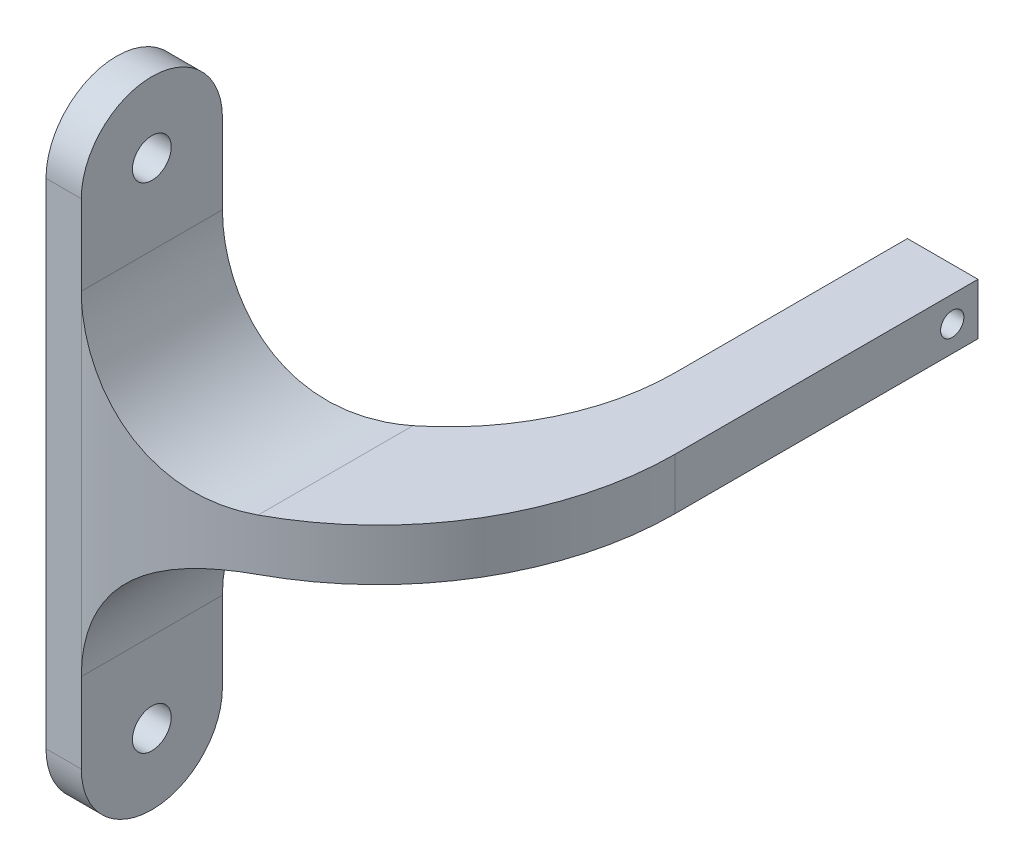
ISO-10303-21;
HEADER;
FILE_DESCRIPTION(('STEP AP214'),'2;1');
FILE_NAME('part.step','',(''),(''),'','','');
FILE_SCHEMA(('AUTOMOTIVE_DESIGN { 1 0 10303 214 1 1 1 1 }'));
ENDSEC;
DATA;
#1=APPLICATION_CONTEXT('core data for automotive mechanical design processes');
#2=APPLICATION_PROTOCOL_DEFINITION('international standard','automotive_design',2000,#1);
#3=PRODUCT_CONTEXT('',#1,'mechanical');
#4=PRODUCT('Part','Part','',(#3));
#5=PRODUCT_RELATED_PRODUCT_CATEGORY('part','',(#4));
#6=PRODUCT_DEFINITION_FORMATION('','',#4);
#7=PRODUCT_DEFINITION_CONTEXT('part definition',#1,'design');
#8=PRODUCT_DEFINITION('design','',#6,#7);
#9=PRODUCT_DEFINITION_SHAPE('','',#8);
#10=(LENGTH_UNIT() NAMED_UNIT(*) SI_UNIT(.MILLI.,.METRE.));
#11=(NAMED_UNIT(*) PLANE_ANGLE_UNIT() SI_UNIT($,.RADIAN.));
#12=(NAMED_UNIT(*) SI_UNIT($,.STERADIAN.) SOLID_ANGLE_UNIT());
#13=UNCERTAINTY_MEASURE_WITH_UNIT(LENGTH_MEASURE(1.E-05),#10,'distance_accuracy_value','');
#14=(GEOMETRIC_REPRESENTATION_CONTEXT(3) GLOBAL_UNCERTAINTY_ASSIGNED_CONTEXT((#13)) GLOBAL_UNIT_ASSIGNED_CONTEXT((#10,
#11,#12)) REPRESENTATION_CONTEXT('',''));
#15=CARTESIAN_POINT('',(0.,0.,0.));
#16=DIRECTION('',(0.,0.,1.));
#17=DIRECTION('',(1.,0.,0.));
#18=AXIS2_PLACEMENT_3D('',#15,#16,#17);
#19=CARTESIAN_POINT('',(50.25,3.651,-75.));
#20=DIRECTION('',(-1.,0.,0.));
#21=DIRECTION('',(0.,0.,1.));
#22=AXIS2_PLACEMENT_3D('',#19,#20,#21);
#23=PLANE('',#22);
#24=DIRECTION('',(0.,0.,-1.));
#25=VECTOR('',#24,1.);
#26=CARTESIAN_POINT('',(50.25,-3.651,-75.));
#27=LINE('',#26,#25);
#28=CARTESIAN_POINT('',(50.25,-3.651,-32.075));
#29=VERTEX_POINT('',#28);
#30=CARTESIAN_POINT('',(50.25,-3.651,-75.));
#31=VERTEX_POINT('',#30);
#32=EDGE_CURVE('E167',#29,#31,#27,.T.);
#33=ORIENTED_EDGE('',*,*,#32,.T.);
#34=DIRECTION('',(0.,-1.,0.));
#35=VECTOR('',#34,1.);
#36=CARTESIAN_POINT('',(50.25,3.651,-75.));
#37=LINE('',#36,#35);
#38=CARTESIAN_POINT('',(50.25,3.651,-75.));
#39=VERTEX_POINT('',#38);
#40=EDGE_CURVE('E146',#39,#31,#37,.T.);
#41=ORIENTED_EDGE('',*,*,#40,.F.);
#42=DIRECTION('',(0.,0.,-1.));
#43=VECTOR('',#42,1.);
#44=CARTESIAN_POINT('',(50.25,3.651,-75.));
#45=LINE('',#44,#43);
#46=CARTESIAN_POINT('',(50.25,3.651,-32.075));
#47=VERTEX_POINT('',#46);
#48=EDGE_CURVE('E131',#47,#39,#45,.T.);
#49=ORIENTED_EDGE('',*,*,#48,.F.);
#50=DIRECTION('',(0.,-1.,0.));
#51=VECTOR('',#50,1.);
#52=CARTESIAN_POINT('',(50.25,3.651,-32.075));
#53=LINE('',#52,#51);
#54=EDGE_CURVE('E142',#47,#29,#53,.T.);
#55=ORIENTED_EDGE('',*,*,#54,.T.);
#56=EDGE_LOOP('',(#33,#41,#49,#55));
#57=FACE_BOUND('',#56,.T.);
#58=CARTESIAN_POINT('',(50.250012,0.,-71.3489999999999));
#59=DIRECTION('',(1.,0.,0.));
#60=DIRECTION('',(0.,0.,-1.));
#61=AXIS2_PLACEMENT_3D('',#58,#59,#60);
#62=CIRCLE('',#61,1.651);
#63=CARTESIAN_POINT('',(50.250012,0.,-72.9999999999999));
#64=VERTEX_POINT('',#63);
#65=EDGE_CURVE('E305',#64,#64,#62,.T.);
#66=ORIENTED_EDGE('',*,*,#65,.F.);
#67=EDGE_LOOP('',(#66));
#68=FACE_BOUND('',#67,.T.);
#69=ADVANCED_FACE('F39',(#57,#68),#23,.F.);
#70=CARTESIAN_POINT('',(8.175,-35.,0.));
#71=DIRECTION('',(1.,0.,0.));
#72=DIRECTION('',(0.,0.,-1.));
#73=AXIS2_PLACEMENT_3D('',#70,#71,#72);
#74=PLANE('',#73);
#75=CARTESIAN_POINT('',(8.175,-35.,0.));
#76=DIRECTION('',(1.,0.,0.));
#77=DIRECTION('',(0.,0.,-1.));
#78=AXIS2_PLACEMENT_3D('',#75,#76,#77);
#79=CIRCLE('',#78,2.75);
#80=CARTESIAN_POINT('',(8.175,-35.,-2.75));
#81=VERTEX_POINT('',#80);
#82=EDGE_CURVE('E186',#81,#81,#79,.T.);
#83=ORIENTED_EDGE('',*,*,#82,.F.);
#84=EDGE_LOOP('',(#83));
#85=FACE_BOUND('',#84,.T.);
#86=DIRECTION('',(0.,1.,0.));
#87=VECTOR('',#86,1.);
#88=CARTESIAN_POINT('',(8.175,-35.,-10.));
#89=LINE('',#88,#87);
#90=CARTESIAN_POINT('',(8.175,-35.,-10.));
#91=VERTEX_POINT('',#90);
#92=CARTESIAN_POINT('',(8.175,-23.651,-10.));
#93=VERTEX_POINT('',#92);
#94=EDGE_CURVE('E200',#91,#93,#89,.T.);
#95=ORIENTED_EDGE('',*,*,#94,.T.);
#96=DIRECTION('',(0.,0.,1.));
#97=VECTOR('',#96,1.);
#98=CARTESIAN_POINT('',(8.175,-23.651,10.));
#99=LINE('',#98,#97);
#100=CARTESIAN_POINT('',(8.175,-23.651,10.));
#101=VERTEX_POINT('',#100);
#102=EDGE_CURVE('E228',#93,#101,#99,.T.);
#103=ORIENTED_EDGE('',*,*,#102,.T.);
#104=DIRECTION('',(0.,-1.,0.));
#105=VECTOR('',#104,1.);
#106=CARTESIAN_POINT('',(8.175,-35.,10.));
#107=LINE('',#106,#105);
#108=CARTESIAN_POINT('',(8.175,-35.,10.));
#109=VERTEX_POINT('',#108);
#110=EDGE_CURVE('E204',#101,#109,#107,.T.);
#111=ORIENTED_EDGE('',*,*,#110,.T.);
#112=CARTESIAN_POINT('',(8.175,-35.,0.));
#113=DIRECTION('',(1.,0.,0.));
#114=DIRECTION('',(0.,0.,-1.));
#115=AXIS2_PLACEMENT_3D('',#112,#113,#114);
#116=CIRCLE('',#115,10.);
#117=EDGE_CURVE('E193',#109,#91,#116,.T.);
#118=ORIENTED_EDGE('',*,*,#117,.T.);
#119=EDGE_LOOP('',(#95,#103,#111,#118));
#120=FACE_BOUND('',#119,.T.);
#121=ADVANCED_FACE('F278',(#85,#120),#74,.T.);
#122=CARTESIAN_POINT('',(8.175,35.,10.));
#123=VERTEX_POINT('',#122);
#124=CARTESIAN_POINT('',(8.175,23.651,10.));
#125=VERTEX_POINT('',#124);
#126=EDGE_CURVE('E202',#123,#125,#107,.T.);
#127=ORIENTED_EDGE('',*,*,#126,.T.);
#128=DIRECTION('',(0.,0.,1.));
#129=VECTOR('',#128,1.);
#130=CARTESIAN_POINT('',(8.175,23.651,0.));
#131=LINE('',#130,#129);
#132=CARTESIAN_POINT('',(8.175,23.651,-9.99999999999999));
#133=VERTEX_POINT('',#132);
#134=EDGE_CURVE('E231',#125,#133,#131,.F.);
#135=ORIENTED_EDGE('',*,*,#134,.T.);
#136=CARTESIAN_POINT('',(8.175,35.,-9.99999999999999));
#137=VERTEX_POINT('',#136);
#138=EDGE_CURVE('E197',#133,#137,#89,.T.);
#139=ORIENTED_EDGE('',*,*,#138,.T.);
#140=CARTESIAN_POINT('',(8.175,35.,0.));
#141=DIRECTION('',(1.,0.,0.));
#142=DIRECTION('',(0.,0.,-1.));
#143=AXIS2_PLACEMENT_3D('',#140,#141,#142);
#144=CIRCLE('',#143,10.);
#145=EDGE_CURVE('E205',#137,#123,#144,.T.);
#146=ORIENTED_EDGE('',*,*,#145,.T.);
#147=EDGE_LOOP('',(#127,#135,#139,#146));
#148=FACE_BOUND('',#147,.T.);
#149=CARTESIAN_POINT('',(8.175,35.,0.));
#150=DIRECTION('',(1.,0.,0.));
#151=DIRECTION('',(0.,0.,-1.));
#152=AXIS2_PLACEMENT_3D('',#149,#150,#151);
#153=CIRCLE('',#152,2.75);
#154=CARTESIAN_POINT('',(8.175,35.,-2.74999999999999));
#155=VERTEX_POINT('',#154);
#156=EDGE_CURVE('E185',#155,#155,#153,.T.);
#157=ORIENTED_EDGE('',*,*,#156,.F.);
#158=EDGE_LOOP('',(#157));
#159=FACE_BOUND('',#158,.T.);
#160=ADVANCED_FACE('F277',(#148,#159),#74,.T.);
#161=CARTESIAN_POINT('',(3.175,-35.,0.));
#162=DIRECTION('',(1.,0.,0.));
#163=DIRECTION('',(0.,0.,-1.));
#164=AXIS2_PLACEMENT_3D('',#161,#162,#163);
#165=PLANE('',#164);
#166=CARTESIAN_POINT('',(3.175,-35.,0.));
#167=DIRECTION('',(1.,0.,0.));
#168=DIRECTION('',(0.,0.,-1.));
#169=AXIS2_PLACEMENT_3D('',#166,#167,#168);
#170=CIRCLE('',#169,10.);
#171=CARTESIAN_POINT('',(3.175,-35.,10.));
#172=VERTEX_POINT('',#171);
#173=CARTESIAN_POINT('',(3.175,-35.,-10.));
#174=VERTEX_POINT('',#173);
#175=EDGE_CURVE('E194',#172,#174,#170,.T.);
#176=ORIENTED_EDGE('',*,*,#175,.F.);
#177=DIRECTION('',(0.,-1.,0.));
#178=VECTOR('',#177,1.);
#179=CARTESIAN_POINT('',(3.175,-35.,10.));
#180=LINE('',#179,#178);
#181=CARTESIAN_POINT('',(3.175,35.,10.));
#182=VERTEX_POINT('',#181);
#183=EDGE_CURVE('E196',#182,#172,#180,.T.);
#184=ORIENTED_EDGE('',*,*,#183,.F.);
#185=CARTESIAN_POINT('',(3.175,35.,0.));
#186=DIRECTION('',(1.,0.,0.));
#187=DIRECTION('',(0.,0.,-1.));
#188=AXIS2_PLACEMENT_3D('',#185,#186,#187);
#189=CIRCLE('',#188,10.);
#190=CARTESIAN_POINT('',(3.175,35.,-9.99999999999999));
#191=VERTEX_POINT('',#190);
#192=EDGE_CURVE('E215',#191,#182,#189,.T.);
#193=ORIENTED_EDGE('',*,*,#192,.F.);
#194=DIRECTION('',(0.,1.,0.));
#195=VECTOR('',#194,1.);
#196=CARTESIAN_POINT('',(3.175,-35.,-10.));
#197=LINE('',#196,#195);
#198=EDGE_CURVE('E209',#174,#191,#197,.T.);
#199=ORIENTED_EDGE('',*,*,#198,.F.);
#200=EDGE_LOOP('',(#176,#184,#193,#199));
#201=FACE_BOUND('',#200,.T.);
#202=CARTESIAN_POINT('',(3.175,-35.,0.));
#203=DIRECTION('',(1.,0.,0.));
#204=DIRECTION('',(0.,0.,-1.));
#205=AXIS2_PLACEMENT_3D('',#202,#203,#204);
#206=CIRCLE('',#205,2.75);
#207=CARTESIAN_POINT('',(3.175,-35.,-2.75));
#208=VERTEX_POINT('',#207);
#209=EDGE_CURVE('E183',#208,#208,#206,.T.);
#210=ORIENTED_EDGE('',*,*,#209,.T.);
#211=EDGE_LOOP('',(#210));
#212=FACE_BOUND('',#211,.T.);
#213=CARTESIAN_POINT('',(3.175,35.,0.));
#214=DIRECTION('',(1.,0.,0.));
#215=DIRECTION('',(0.,0.,-1.));
#216=AXIS2_PLACEMENT_3D('',#213,#214,#215);
#217=CIRCLE('',#216,2.75);
#218=CARTESIAN_POINT('',(3.175,35.,-2.74999999999999));
#219=VERTEX_POINT('',#218);
#220=EDGE_CURVE('E182',#219,#219,#217,.T.);
#221=ORIENTED_EDGE('',*,*,#220,.T.);
#222=EDGE_LOOP('',(#221));
#223=FACE_BOUND('',#222,.T.);
#224=ADVANCED_FACE('F261',(#201,#212,#223),#165,.F.);
#225=CARTESIAN_POINT('',(8.175,-35.,0.));
#226=DIRECTION('',(-1.,0.,0.));
#227=DIRECTION('',(0.,0.,1.));
#228=AXIS2_PLACEMENT_3D('',#225,#226,#227);
#229=CYLINDRICAL_SURFACE('',#228,10.);
#230=ORIENTED_EDGE('',*,*,#175,.T.);
#231=DIRECTION('',(-1.,0.,0.));
#232=VECTOR('',#231,1.);
#233=CARTESIAN_POINT('',(8.175,-35.,-10.));
#234=LINE('',#233,#232);
#235=EDGE_CURVE('E224',#91,#174,#234,.T.);
#236=ORIENTED_EDGE('',*,*,#235,.F.);
#237=ORIENTED_EDGE('',*,*,#117,.F.);
#238=DIRECTION('',(-1.,0.,0.));
#239=VECTOR('',#238,1.);
#240=CARTESIAN_POINT('',(8.175,-35.,10.));
#241=LINE('',#240,#239);
#242=EDGE_CURVE('E210',#109,#172,#241,.T.);
#243=ORIENTED_EDGE('',*,*,#242,.T.);
#244=EDGE_LOOP('',(#230,#236,#237,#243));
#245=FACE_BOUND('',#244,.T.);
#246=ADVANCED_FACE('F258',(#245),#229,.T.);
#247=CARTESIAN_POINT('',(8.175,-35.,-10.));
#248=DIRECTION('',(0.,0.,1.));
#249=DIRECTION('',(0.,-1.,0.));
#250=AXIS2_PLACEMENT_3D('',#247,#248,#249);
#251=PLANE('',#250);
#252=ORIENTED_EDGE('',*,*,#198,.T.);
#253=DIRECTION('',(-1.,0.,0.));
#254=VECTOR('',#253,1.);
#255=CARTESIAN_POINT('',(8.175,35.,-9.99999999999999));
#256=LINE('',#255,#254);
#257=EDGE_CURVE('E219',#137,#191,#256,.T.);
#258=ORIENTED_EDGE('',*,*,#257,.F.);
#259=ORIENTED_EDGE('',*,*,#138,.F.);
#260=DIRECTION('',(0.,-1.,0.));
#261=VECTOR('',#260,1.);
#262=CARTESIAN_POINT('',(8.175,3.651,-9.99999999999999));
#263=LINE('',#262,#261);
#264=EDGE_CURVE('E178',#133,#93,#263,.T.);
#265=ORIENTED_EDGE('',*,*,#264,.T.);
#266=ORIENTED_EDGE('',*,*,#94,.F.);
#267=ORIENTED_EDGE('',*,*,#235,.T.);
#268=EDGE_LOOP('',(#252,#258,#259,#265,#266,#267));
#269=FACE_BOUND('',#268,.T.);
#270=ADVANCED_FACE('F257',(#269),#251,.F.);
#271=CARTESIAN_POINT('',(8.175,35.,0.));
#272=DIRECTION('',(-1.,0.,0.));
#273=DIRECTION('',(0.,0.,1.));
#274=AXIS2_PLACEMENT_3D('',#271,#272,#273);
#275=CYLINDRICAL_SURFACE('',#274,10.);
#276=ORIENTED_EDGE('',*,*,#192,.T.);
#277=DIRECTION('',(-1.,0.,0.));
#278=VECTOR('',#277,1.);
#279=CARTESIAN_POINT('',(8.175,35.,10.));
#280=LINE('',#279,#278);
#281=EDGE_CURVE('E220',#123,#182,#280,.T.);
#282=ORIENTED_EDGE('',*,*,#281,.F.);
#283=ORIENTED_EDGE('',*,*,#145,.F.);
#284=ORIENTED_EDGE('',*,*,#257,.T.);
#285=EDGE_LOOP('',(#276,#282,#283,#284));
#286=FACE_BOUND('',#285,.T.);
#287=ADVANCED_FACE('F264',(#286),#275,.T.);
#288=CARTESIAN_POINT('',(8.175,-35.,10.));
#289=DIRECTION('',(0.,0.,-1.));
#290=DIRECTION('',(0.,1.,0.));
#291=AXIS2_PLACEMENT_3D('',#288,#289,#290);
#292=PLANE('',#291);
#293=ORIENTED_EDGE('',*,*,#183,.T.);
#294=ORIENTED_EDGE('',*,*,#242,.F.);
#295=ORIENTED_EDGE('',*,*,#110,.F.);
#296=DIRECTION('',(0.,-1.,0.));
#297=VECTOR('',#296,1.);
#298=CARTESIAN_POINT('',(8.175,3.651,10.));
#299=LINE('',#298,#297);
#300=EDGE_CURVE('E58',#125,#101,#299,.T.);
#301=ORIENTED_EDGE('',*,*,#300,.F.);
#302=ORIENTED_EDGE('',*,*,#126,.F.);
#303=ORIENTED_EDGE('',*,*,#281,.T.);
#304=EDGE_LOOP('',(#293,#294,#295,#301,#302,#303));
#305=FACE_BOUND('',#304,.T.);
#306=ADVANCED_FACE('F267',(#305),#292,.F.);
#307=CARTESIAN_POINT('',(8.175,-35.,0.));
#308=DIRECTION('',(-1.,0.,0.));
#309=DIRECTION('',(0.,0.,1.));
#310=AXIS2_PLACEMENT_3D('',#307,#308,#309);
#311=CYLINDRICAL_SURFACE('',#310,2.75);
#312=ORIENTED_EDGE('',*,*,#82,.T.);
#313=EDGE_LOOP('',(#312));
#314=FACE_BOUND('',#313,.T.);
#315=ORIENTED_EDGE('',*,*,#209,.F.);
#316=EDGE_LOOP('',(#315));
#317=FACE_BOUND('',#316,.T.);
#318=ADVANCED_FACE('F272',(#314,#317),#311,.F.);
#319=CARTESIAN_POINT('',(8.175,35.,0.));
#320=DIRECTION('',(-1.,0.,0.));
#321=DIRECTION('',(0.,0.,1.));
#322=AXIS2_PLACEMENT_3D('',#319,#320,#321);
#323=CYLINDRICAL_SURFACE('',#322,2.75);
#324=ORIENTED_EDGE('',*,*,#156,.T.);
#325=EDGE_LOOP('',(#324));
#326=FACE_BOUND('',#325,.T.);
#327=ORIENTED_EDGE('',*,*,#220,.F.);
#328=EDGE_LOOP('',(#327));
#329=FACE_BOUND('',#328,.T.);
#330=ADVANCED_FACE('F284',(#326,#329),#323,.F.);
#331=CARTESIAN_POINT('',(8.17499999999999,3.651,-42.075));
#332=DIRECTION('',(0.,-1.,0.));
#333=DIRECTION('',(0.,0.,-1.));
#334=AXIS2_PLACEMENT_3D('',#331,#332,#333);
#335=CYLINDRICAL_SURFACE('',#334,32.075);
#336=CARTESIAN_POINT('',(8.17499999999999,-3.651,-42.075));
#337=DIRECTION('',(0.,-1.,0.));
#338=DIRECTION('',(0.,0.,-1.));
#339=AXIS2_PLACEMENT_3D('',#336,#337,#338);
#340=CIRCLE('',#339,32.075);
#341=CARTESIAN_POINT('',(40.25,-3.651,-42.075));
#342=VERTEX_POINT('',#341);
#343=CARTESIAN_POINT('',(28.175,-3.651,-16.9990030108472));
#344=VERTEX_POINT('',#343);
#345=EDGE_CURVE('E161',#342,#344,#340,.T.);
#346=ORIENTED_EDGE('',*,*,#345,.T.);
#347=CARTESIAN_POINT('',(28.175,-3.651,-16.9990030108472));
#348=CARTESIAN_POINT('',(27.9586962296863,-3.65100077288611,-16.8264822795104));
#349=CARTESIAN_POINT('',(27.7401723432096,-3.6545097782281,-16.6567754511387));
#350=CARTESIAN_POINT('',(27.2989436823594,-3.66897620219931,-16.3231668865758));
#351=CARTESIAN_POINT('',(27.0762384488934,-3.67993444342554,-16.1592657935979));
#352=CARTESIAN_POINT('',(26.4020416588378,-3.72464794379476,-15.6763995454438));
#353=CARTESIAN_POINT('',(25.9447303078518,-3.77024302452508,-15.3664797604755));
#354=CARTESIAN_POINT('',(25.016854472668,-3.89635634494245,-14.7718483380446));
#355=CARTESIAN_POINT('',(24.5462567591916,-3.97697105928128,-14.4872089729705));
#356=CARTESIAN_POINT('',(23.5972333755666,-4.17591405942158,-13.9456797853001));
#357=CARTESIAN_POINT('',(23.1188099680433,-4.29423162093451,-13.6887820995807));
#358=CARTESIAN_POINT('',(22.156169857968,-4.5715363126506,-13.2024364696579));
#359=CARTESIAN_POINT('',(21.6719357247185,-4.73074673790516,-12.9731497268887));
#360=CARTESIAN_POINT('',(20.7057595874264,-5.09092906783924,-12.54425202995));
#361=CARTESIAN_POINT('',(20.2238177999153,-5.29190484051116,-12.344643827323));
#362=CARTESIAN_POINT('',(19.2692044577071,-5.73555446087539,-11.9754052955371));
#363=CARTESIAN_POINT('',(18.7965141231892,-5.97813129295255,-11.8057070412341));
#364=CARTESIAN_POINT('',(17.8651265375307,-6.50478620127489,-11.4948085427738));
#365=CARTESIAN_POINT('',(17.4064280408911,-6.78886057046228,-11.3536057557401));
#366=CARTESIAN_POINT('',(16.5470612208128,-7.37104469202194,-11.1089462628015));
#367=CARTESIAN_POINT('',(16.1447866846168,-7.66587113038527,-11.0032930558736));
#368=CARTESIAN_POINT('',(15.3605348317643,-8.28741356820396,-10.8126173162209));
#369=CARTESIAN_POINT('',(14.9785563830144,-8.61412778610426,-10.7275936318584));
#370=CARTESIAN_POINT('',(14.2381276792386,-9.29768394594519,-10.5759988220356));
#371=CARTESIAN_POINT('',(13.8796956743231,-9.65454877818102,-10.5094418837329));
#372=CARTESIAN_POINT('',(13.1897408764947,-10.3958713758724,-10.3925053395733));
#373=CARTESIAN_POINT('',(12.8582190376427,-10.7803301187204,-10.3421263070937));
#374=CARTESIAN_POINT('',(12.2204935331733,-11.5796044364059,-10.2544937983045));
#375=CARTESIAN_POINT('',(11.9146866911056,-11.9947566035956,-10.2174244172783));
#376=CARTESIAN_POINT('',(11.335714617738,-12.8480233190294,-10.1547819411609));
#377=CARTESIAN_POINT('',(11.0625490299269,-13.2861376164033,-10.1292087204991));
#378=CARTESIAN_POINT('',(10.5506819252401,-14.1826358092533,-10.0870685665446));
#379=CARTESIAN_POINT('',(10.311990722166,-14.6410257172864,-10.0705043244119));
#380=CARTESIAN_POINT('',(9.87072787558938,-15.575080803634,-10.0440932160683));
#381=CARTESIAN_POINT('',(9.66815931585596,-16.0507474526854,-10.0342469231622));
#382=CARTESIAN_POINT('',(9.2686987236155,-17.0997599584029,-10.0179238598067));
#383=CARTESIAN_POINT('',(9.07881619885814,-17.6757991137424,-10.0123215558863));
#384=CARTESIAN_POINT('',(8.7520845022036,-18.8429273027489,-10.004773992639));
#385=CARTESIAN_POINT('',(8.61524503215746,-19.4340190685667,-10.0028294020765));
#386=CARTESIAN_POINT('',(8.45058847854055,-20.3283827703133,-10.001139066239));
#387=CARTESIAN_POINT('',(8.40244680391711,-20.6280459621079,-10.0007802608652));
#388=CARTESIAN_POINT('',(8.31984205771568,-21.2292768267231,-10.0003000209934));
#389=CARTESIAN_POINT('',(8.28537904433368,-21.5308445076409,-10.0001785875053));
#390=CARTESIAN_POINT('',(8.23021628184606,-22.1351956076145,-10.0000351448827));
#391=CARTESIAN_POINT('',(8.20951496886089,-22.4379788845946,-10.0000131244493));
#392=CARTESIAN_POINT('',(8.18190453384379,-23.0441736928992,-10.0000002471042));
#393=CARTESIAN_POINT('',(8.1749954168045,-23.3475852244511,-10.0000093902039));
#394=CARTESIAN_POINT('',(8.175,-23.651,-9.99999999999999));
#395=B_SPLINE_CURVE_WITH_KNOTS('',3,(#347,#348,#349,#350,#351,#352,#353,#354,#355,#356,#357,
#358,#359,#360,#361,#362,#363,#364,#365,#366,#367,#368,#369,#370,#371,#372,#373,#374,#375,#376,
#377,#378,#379,#380,#381,#382,#383,#384,#385,#386,#387,#388,#389,#390,#391,#392,#393,#394),
.UNSPECIFIED.,.F.,.F.,(4,2,2,2,2,2,2,2,2,2,2,2,2,2,2,2,2,2,2,2,2,2,2,4),(0.,0.829944378609106,
1.65998042040372,3.32105246730453,4.98672986864396,6.65193390297928,8.32643158880807,
10.0010844231867,11.671883714097,13.3425338403438,14.8701664514304,16.3977137632125,
17.9264313907269,19.4552031930621,21.0043725231374,22.5535249314683,24.1031398484365,
25.6528869918635,27.4700193722662,29.2874839589964,30.197742628144,31.1080051699552,
32.0181642518459,32.9283236632046),.UNSPECIFIED.);
#396=EDGE_CURVE('E245',#344,#93,#395,.T.);
#397=ORIENTED_EDGE('',*,*,#396,.T.);
#398=ORIENTED_EDGE('',*,*,#264,.F.);
#399=CARTESIAN_POINT('',(8.175,23.651,-9.99999999999999));
#400=CARTESIAN_POINT('',(8.17499965500632,23.3708049620813,-10.0000052075874));
#401=CARTESIAN_POINT('',(8.18088888967961,23.0906408260947,-9.99999936862738));
#402=CARTESIAN_POINT('',(8.2044296011963,22.5308140618039,-10.0000103538769));
#403=CARTESIAN_POINT('',(8.22208078890394,22.2511514213413,-10.0000271775294));
#404=CARTESIAN_POINT('',(8.29264104162307,21.413688711776,-10.0001787471465));
#405=CARTESIAN_POINT('',(8.36315681353342,20.8572788424516,-10.0004145512831));
#406=CARTESIAN_POINT('',(8.55066186503644,19.7523671035781,-10.0020632167622));
#407=CARTESIAN_POINT('',(8.66764943453669,19.2038649438066,-10.0034760347946));
#408=CARTESIAN_POINT('',(8.87729598003518,18.3900928894024,-10.0076147356231));
#409=CARTESIAN_POINT('',(8.95287588668304,18.1203223072163,-10.0093309852697));
#410=CARTESIAN_POINT('',(9.11531590766684,17.584127929503,-10.0136831432339));
#411=CARTESIAN_POINT('',(9.20217902644482,17.317705046183,-10.0163192968157));
#412=CARTESIAN_POINT('',(9.47954597455383,16.523998850214,-10.0260035211679));
#413=CARTESIAN_POINT('',(9.68677517261345,16.0024806176687,-10.0348267135702));
#414=CARTESIAN_POINT('',(10.1442498731848,14.9788432843409,-10.0596897997399));
#415=CARTESIAN_POINT('',(10.3944943310763,14.4767237128269,-10.0757295182701));
#416=CARTESIAN_POINT('',(10.8006010547298,13.740963697608,-10.1073564989679));
#417=CARTESIAN_POINT('',(10.9411137029947,13.4985830037076,-10.1191621000649));
#418=CARTESIAN_POINT('',(11.2320773889571,13.020112810902,-10.1456835563437));
#419=CARTESIAN_POINT('',(11.3825258971193,12.7840217320622,-10.1603986726898));
#420=CARTESIAN_POINT('',(11.8484042000193,12.0857407036002,-10.2095127252771));
#421=CARTESIAN_POINT('',(12.1784026144201,11.6334780668559,-10.2488829349425));
#422=CARTESIAN_POINT('',(12.8686889276493,10.7661526549979,-10.3434021072489));
#423=CARTESIAN_POINT('',(13.2284197227793,10.3506171972493,-10.3982935480785));
#424=CARTESIAN_POINT('',(13.9792302508538,9.55205005645675,-10.5272338399507));
#425=CARTESIAN_POINT('',(14.3703097298163,9.1690181101263,-10.6012825357951));
#426=CARTESIAN_POINT('',(15.1793497105101,8.43884532566482,-10.771400772342));
#427=CARTESIAN_POINT('',(15.597277393268,8.09166197154051,-10.8674437825243));
#428=CARTESIAN_POINT('',(16.4558481051204,7.43516077541825,-11.0842093775277));
#429=CARTESIAN_POINT('',(16.8964895749026,7.12584033902004,-11.2049302698835));
#430=CARTESIAN_POINT('',(17.767662540358,6.56477650480683,-11.4648683157611));
#431=CARTESIAN_POINT('',(18.1971448550203,6.31066013386651,-11.6024880811913));
#432=CARTESIAN_POINT('',(19.0670601481779,5.83835380030862,-11.9024912732941));
#433=CARTESIAN_POINT('',(19.5074927566108,5.62016262550212,-12.0648738640627));
#434=CARTESIAN_POINT('',(20.3954444633789,5.21960860618497,-12.4153544842654));
#435=CARTESIAN_POINT('',(20.8429749449223,5.03731132285208,-12.6034985246608));
#436=CARTESIAN_POINT('',(21.7396878251736,4.70859162757914,-13.0053202095785));
#437=CARTESIAN_POINT('',(22.1888701813363,4.56216829815941,-13.2189972008852));
#438=CARTESIAN_POINT('',(23.1166694532695,4.29479290073646,-13.6876581573029));
#439=CARTESIAN_POINT('',(23.5950882902887,4.17641899089713,-13.9445051410285));
#440=CARTESIAN_POINT('',(24.5441316669877,3.97736149279031,-14.4859471702762));
#441=CARTESIAN_POINT('',(25.0147533866481,3.89669126583939,-14.7705520094234));
#442=CARTESIAN_POINT('',(25.9430346816081,3.77042445976717,-15.3653432907693));
#443=CARTESIAN_POINT('',(26.4007184484198,3.72475758621545,-15.6754770700379));
#444=CARTESIAN_POINT('',(27.075442140913,3.67997634680158,-16.1586828937676));
#445=CARTESIAN_POINT('',(27.2983109046423,3.66900215635532,-16.3226948403143));
#446=CARTESIAN_POINT('',(27.7398605112776,3.65451480871851,-16.656533302167));
#447=CARTESIAN_POINT('',(27.9585418211841,3.65100081467974,-16.8263591631247));
#448=CARTESIAN_POINT('',(28.175,3.651,-16.9990030108472));
#449=B_SPLINE_CURVE_WITH_KNOTS('',3,(#399,#400,#401,#402,#403,#404,#405,#406,#407,#408,#409,
#410,#411,#412,#413,#414,#415,#416,#417,#418,#419,#420,#421,#422,#423,#424,#425,#426,#427,#428,
#429,#430,#431,#432,#433,#434,#435,#436,#437,#438,#439,#440,#441,#442,#443,#444,#445,#446,#447,
#448),.UNSPECIFIED.,.F.,.F.,(4,2,2,2,2,2,2,2,2,2,2,2,2,2,2,2,2,2,2,2,2,2,2,2,4),(0.,
0.840461542395345,1.68090242508329,3.36138046078355,5.04179666314114,5.88206871810422,
6.72256497728196,8.40418319991509,10.0857605904284,10.9267694346927,11.7675649887733,
13.4489343127127,15.1038971433888,16.7588465671775,18.4118101354442,20.0646603777225,
21.6156982283196,23.1666837330258,24.7204763979788,26.2742293203922,27.9393569844922,
29.6050742848969,31.2674376303308,32.098067145164,32.9286034791312),.UNSPECIFIED.);
#450=CARTESIAN_POINT('',(28.175,3.651,-16.9990030108472));
#451=VERTEX_POINT('',#450);
#452=EDGE_CURVE('E11',#133,#451,#449,.T.);
#453=ORIENTED_EDGE('',*,*,#452,.T.);
#454=CARTESIAN_POINT('',(8.17499999999999,3.651,-42.075));
#455=DIRECTION('',(0.,-1.,0.));
#456=DIRECTION('',(0.,0.,-1.));
#457=AXIS2_PLACEMENT_3D('',#454,#455,#456);
#458=CIRCLE('',#457,32.075);
#459=CARTESIAN_POINT('',(40.25,3.651,-42.075));
#460=VERTEX_POINT('',#459);
#461=EDGE_CURVE('E138',#460,#451,#458,.T.);
#462=ORIENTED_EDGE('',*,*,#461,.F.);
#463=DIRECTION('',(0.,-1.,0.));
#464=VECTOR('',#463,1.);
#465=CARTESIAN_POINT('',(40.25,3.651,-42.075));
#466=LINE('',#465,#464);
#467=EDGE_CURVE('E159',#460,#342,#466,.T.);
#468=ORIENTED_EDGE('',*,*,#467,.T.);
#469=EDGE_LOOP('',(#346,#397,#398,#453,#462,#468));
#470=FACE_BOUND('',#469,.T.);
#471=ADVANCED_FACE('F286',(#470),#335,.F.);
#472=CARTESIAN_POINT('',(8.175,3.651,-32.075));
#473=DIRECTION('',(0.,-1.,0.));
#474=DIRECTION('',(0.,0.,-1.));
#475=AXIS2_PLACEMENT_3D('',#472,#473,#474);
#476=CYLINDRICAL_SURFACE('',#475,42.075);
#477=ORIENTED_EDGE('',*,*,#300,.T.);
#478=CARTESIAN_POINT('',(8.175,-23.651,10.));
#479=CARTESIAN_POINT('',(8.17499965634887,-23.3703483071798,9.99999600462153));
#480=CARTESIAN_POINT('',(8.18090810413726,-23.0897276813002,10.0000004846679));
#481=CARTESIAN_POINT('',(8.20452557039146,-22.5289902815656,9.99999205516163));
#482=CARTESIAN_POINT('',(8.22223430246735,-22.248873495648,9.99997914603095));
#483=CARTESIAN_POINT('',(8.29302414096695,-21.4100596086477,9.99986284749446));
#484=CARTESIAN_POINT('',(8.36376890766114,-20.852759442492,9.99968191899783));
#485=CARTESIAN_POINT('',(8.55185149787787,-19.7462780753369,9.99841713007093));
#486=CARTESIAN_POINT('',(8.66917307227902,-19.1970941120914,9.99733358438957));
#487=CARTESIAN_POINT('',(8.8794080541075,-18.3823319912789,9.99416035487193));
#488=CARTESIAN_POINT('',(8.95519879845415,-18.1122364975523,9.99284454450688));
#489=CARTESIAN_POINT('',(9.1180894043543,-17.5754045446576,9.98950819672605));
#490=CARTESIAN_POINT('',(9.20519222852595,-17.3086689855981,9.98748747446023));
#491=CARTESIAN_POINT('',(9.48330451747362,-16.5140926794706,9.98006530989605));
#492=CARTESIAN_POINT('',(9.69107916123361,-15.9920319787468,9.97330423333826));
#493=CARTESIAN_POINT('',(10.1497710272586,-14.9673250268889,9.95425796395801));
#494=CARTESIAN_POINT('',(10.4006876419287,-14.464678502455,9.94197284893003));
#495=CARTESIAN_POINT('',(10.8079353587977,-13.7281044955778,9.91775796458179));
#496=CARTESIAN_POINT('',(10.9488485745883,-13.4854514258912,9.90872038847527));
#497=CARTESIAN_POINT('',(11.2406717627012,-13.0064157245947,9.88842073156759));
#498=CARTESIAN_POINT('',(11.3915791797378,-12.7700315116637,9.87715921792751));
#499=CARTESIAN_POINT('',(11.8589478929288,-12.0708177964167,9.8395783407987));
#500=CARTESIAN_POINT('',(12.1900877629556,-11.6178691661467,9.80946088199476));
#501=CARTESIAN_POINT('',(12.8854108209949,-10.7460959054392,9.73694397436784));
#502=CARTESIAN_POINT('',(13.2492596860986,-10.3269941606188,9.69466082201146));
#503=CARTESIAN_POINT('',(14.0095653017598,-9.52134421814422,9.59525790632773));
#504=CARTESIAN_POINT('',(14.406021953821,-9.13479592216502,9.53813818781512));
#505=CARTESIAN_POINT('',(15.2277408558233,-8.39737588719587,9.40677228058082));
#506=CARTESIAN_POINT('',(15.6529844607017,-8.04648141702226,9.33253710382702));
#507=CARTESIAN_POINT('',(16.5285150404999,-7.3825898872437,9.16482294817266));
#508=CARTESIAN_POINT('',(16.9788009115416,-7.06959115910106,9.07134481702309));
#509=CARTESIAN_POINT('',(17.8828196593806,-6.49444858876701,8.86728238066698));
#510=CARTESIAN_POINT('',(18.3357968252944,-6.23084284190064,8.75746661953339));
#511=CARTESIAN_POINT('',(19.2566964326065,-5.74190665910218,8.51721624870118));
#512=CARTESIAN_POINT('',(19.7246188473198,-5.51657615483344,8.38678167581621));
#513=CARTESIAN_POINT('',(20.6714676230609,-5.10473896406153,8.10444987258188));
#514=CARTESIAN_POINT('',(21.1504033789132,-4.91826690109398,7.95253370232084));
#515=CARTESIAN_POINT('',(22.1144854448081,-4.58452853702779,7.62707973974976));
#516=CARTESIAN_POINT('',(22.599631154838,-4.43725847771168,7.45354402240562));
#517=CARTESIAN_POINT('',(23.5139513854899,-4.19667553554469,7.10703637619835));
#518=CARTESIAN_POINT('',(23.9429042515055,-4.09902341410534,6.93646305942631));
#519=CARTESIAN_POINT('',(24.799732903162,-3.93303858558545,6.57909918130151));
#520=CARTESIAN_POINT('',(25.2276086638415,-3.86470655187845,6.39230824760875));
#521=CARTESIAN_POINT('',(26.078914714797,-3.7565255055826,6.00352099944295));
#522=CARTESIAN_POINT('',(26.5023523650587,-3.71661791798686,5.80155690833331));
#523=CARTESIAN_POINT('',(27.3434778321485,-3.66384486784362,5.38293198825194));
#524=CARTESIAN_POINT('',(27.7611671997371,-3.65097196399747,5.16627522039417));
#525=CARTESIAN_POINT('',(28.175,-3.651,4.94263937638381));
#526=B_SPLINE_CURVE_WITH_KNOTS('',3,(#478,#479,#480,#481,#482,#483,#484,#485,#486,#487,#488,
#489,#490,#491,#492,#493,#494,#495,#496,#497,#498,#499,#500,#501,#502,#503,#504,#505,#506,#507,
#508,#509,#510,#511,#512,#513,#514,#515,#516,#517,#518,#519,#520,#521,#522,#523,#524,#525),
.UNSPECIFIED.,.F.,.F.,(4,2,2,2,2,2,2,2,2,2,2,2,2,2,2,2,2,2,2,2,2,2,2,4),(0.,0.841830875145677,
1.68364132001281,3.36684495681157,5.04946189433075,5.89083641236494,6.73243173128221,
8.41608460867423,10.0997137760919,10.9417277547013,11.7835272748222,13.4669278814846,
15.1347424615682,16.8025520039748,18.4692914689932,20.1359575212857,21.7404272670277,
23.3448941481181,24.9507845810073,26.5565210049099,27.9708493524136,29.3852101800495,
30.7966478974947,32.2076970656613),.UNSPECIFIED.);
#527=CARTESIAN_POINT('',(28.175,-3.651,4.9426393763838));
#528=VERTEX_POINT('',#527);
#529=EDGE_CURVE('E232',#101,#528,#526,.T.);
#530=ORIENTED_EDGE('',*,*,#529,.T.);
#531=CARTESIAN_POINT('',(8.175,-3.651,-32.075));
#532=DIRECTION('',(0.,1.,0.));
#533=DIRECTION('',(0.,0.,-1.));
#534=AXIS2_PLACEMENT_3D('',#531,#532,#533);
#535=CIRCLE('',#534,42.075);
#536=EDGE_CURVE('E144',#528,#29,#535,.T.);
#537=ORIENTED_EDGE('',*,*,#536,.T.);
#538=ORIENTED_EDGE('',*,*,#54,.F.);
#539=CARTESIAN_POINT('',(8.175,3.651,-32.075));
#540=DIRECTION('',(0.,1.,0.));
#541=DIRECTION('',(0.,0.,-1.));
#542=AXIS2_PLACEMENT_3D('',#539,#540,#541);
#543=CIRCLE('',#542,42.075);
#544=CARTESIAN_POINT('',(28.175,3.651,4.9426393763838));
#545=VERTEX_POINT('',#544);
#546=EDGE_CURVE('E126',#545,#47,#543,.T.);
#547=ORIENTED_EDGE('',*,*,#546,.F.);
#548=CARTESIAN_POINT('',(28.175,3.651,4.9426393763838));
#549=CARTESIAN_POINT('',(27.9300182212119,3.6510003809551,5.07500134393818));
#550=CARTESIAN_POINT('',(27.6837397055575,3.65550213133771,5.20491616942424));
#551=CARTESIAN_POINT('',(27.1889074401464,3.67378932209008,5.45970911792319));
#552=CARTESIAN_POINT('',(26.9403534986943,3.68757555187373,5.58458681169639));
#553=CARTESIAN_POINT('',(26.1916512070327,3.74329382200025,5.95149952413489));
#554=CARTESIAN_POINT('',(25.6886274608302,3.79958582212629,6.1857250256612));
#555=CARTESIAN_POINT('',(24.6783062080779,3.95240889726545,6.63226003537795));
#556=CARTESIAN_POINT('',(24.1710045321982,4.04898514431972,6.84454460599853));
#557=CARTESIAN_POINT('',(23.1569661302449,4.28375791240256,7.24603203862273));
#558=CARTESIAN_POINT('',(22.6502293094146,4.42194586668822,7.43523964030558));
#559=CARTESIAN_POINT('',(21.6399547944093,4.74134879980218,7.79088155832665));
#560=CARTESIAN_POINT('',(21.1364367263452,4.922726190307,7.95722608225056));
#561=CARTESIAN_POINT('',(20.1394780518155,5.32833651084344,8.26640934926578));
#562=CARTESIAN_POINT('',(19.6460381991222,5.55257263347842,8.40924633977388));
#563=CARTESIAN_POINT('',(18.6749642567642,6.04291188100766,8.67189024857493));
#564=CARTESIAN_POINT('',(18.1973091291915,6.30895631489713,8.79172893605029));
#565=CARTESIAN_POINT('',(17.2619558973842,6.88179638638465,9.00983291700286));
#566=CARTESIAN_POINT('',(16.8042566717116,7.1885897301339,9.10809942400177));
#567=CARTESIAN_POINT('',(15.937447015496,7.82333084711333,9.27998355676949));
#568=CARTESIAN_POINT('',(15.527047480353,8.14923919466282,9.35464631707031));
#569=CARTESIAN_POINT('',(14.7316803082751,8.83369890703725,9.48794245629453));
#570=CARTESIAN_POINT('',(14.3467118608224,9.19224923065795,9.54657634626351));
#571=CARTESIAN_POINT('',(13.6051330144719,9.93982379696364,9.64980747280698));
#572=CARTESIAN_POINT('',(13.2485388515259,10.3288652377311,9.6943967155004));
#573=CARTESIAN_POINT('',(12.566704412185,11.1346241423373,9.77158064508855));
#574=CARTESIAN_POINT('',(12.2414647682217,11.5513421641361,9.8041750900814));
#575=CARTESIAN_POINT('',(11.6197932548897,12.4165258320961,9.85992592342505));
#576=CARTESIAN_POINT('',(11.3239058001842,12.8653928678983,9.88292289751003));
#577=CARTESIAN_POINT('',(10.769096644765,13.7857447163583,9.92087643834125));
#578=CARTESIAN_POINT('',(10.5101758408199,14.2572300773403,9.93583281005598));
#579=CARTESIAN_POINT('',(10.0311121984806,15.2196150084553,9.95972391110081));
#580=CARTESIAN_POINT('',(9.81096746895125,15.7105136303598,9.96865893415621));
#581=CARTESIAN_POINT('',(9.41092935107147,16.7084774581777,9.98232030302835));
#582=CARTESIAN_POINT('',(9.23103388061435,17.215541826281,9.98704686658771));
#583=CARTESIAN_POINT('',(8.92349774460193,18.2075891964936,9.99360322870975));
#584=CARTESIAN_POINT('',(8.79313598476992,18.6917297333947,9.99560811956109));
#585=CARTESIAN_POINT('',(8.56913434085945,19.6684060964628,9.99830318018457));
#586=CARTESIAN_POINT('',(8.47549274943609,20.1609415311882,9.99899341108905));
#587=CARTESIAN_POINT('',(8.3254592416655,21.1516677151328,9.99979827540324));
#588=CARTESIAN_POINT('',(8.26906466946985,21.6498580585593,9.99991294985609));
#589=CARTESIAN_POINT('',(8.21264140154325,22.3991823371952,9.99998672547976));
#590=CARTESIAN_POINT('',(8.19852840791073,22.6493284873405,9.99999493952955));
#591=CARTESIAN_POINT('',(8.17970776608791,23.1499750568513,10.0000003232115));
#592=CARTESIAN_POINT('',(8.17500014358626,23.4004754771826,9.99999749281342));
#593=CARTESIAN_POINT('',(8.175,23.651,10.));
#594=B_SPLINE_CURVE_WITH_KNOTS('',3,(#548,#549,#550,#551,#552,#553,#554,#555,#556,#557,#558,
#559,#560,#561,#562,#563,#564,#565,#566,#567,#568,#569,#570,#571,#572,#573,#574,#575,#576,#577,
#578,#579,#580,#581,#582,#583,#584,#585,#586,#587,#588,#589,#590,#591,#592,#593),.UNSPECIFIED.,
.F.,.F.,(4,2,2,2,2,2,2,2,2,2,2,2,2,2,2,2,2,2,2,2,2,2,4),(0.,0.835257177680991,1.67058538216293,
3.34180304338842,5.01489975483825,6.6876522554285,8.36679725861643,10.0460673923088,
11.7230008655188,13.3998399803069,14.9860532905517,16.5722160219428,18.1592799350348,
19.7463758530611,21.3588745700284,22.9714123977291,24.5838715590884,26.1962472881371,
27.6990044306886,29.2016916925947,30.7042717958436,31.4557509433949,32.2072321434394),.UNSPECIFIED.);
#595=EDGE_CURVE('E55',#545,#125,#594,.T.);
#596=ORIENTED_EDGE('',*,*,#595,.T.);
#597=EDGE_LOOP('',(#477,#530,#537,#538,#547,#596));
#598=FACE_BOUND('',#597,.T.);
#599=ADVANCED_FACE('F141',(#598),#476,.T.);
#600=CARTESIAN_POINT('',(40.25,3.651,-75.));
#601=DIRECTION('',(0.,0.,1.));
#602=DIRECTION('',(1.,0.,0.));
#603=AXIS2_PLACEMENT_3D('',#600,#601,#602);
#604=PLANE('',#603);
#605=DIRECTION('',(-1.,0.,0.));
#606=VECTOR('',#605,1.);
#607=CARTESIAN_POINT('',(40.25,-3.651,-75.));
#608=LINE('',#607,#606);
#609=CARTESIAN_POINT('',(40.25,-3.651,-75.));
#610=VERTEX_POINT('',#609);
#611=EDGE_CURVE('E169',#31,#610,#608,.T.);
#612=ORIENTED_EDGE('',*,*,#611,.T.);
#613=DIRECTION('',(0.,-1.,0.));
#614=VECTOR('',#613,1.);
#615=CARTESIAN_POINT('',(40.25,3.651,-75.));
#616=LINE('',#615,#614);
#617=CARTESIAN_POINT('',(40.25,3.651,-75.));
#618=VERTEX_POINT('',#617);
#619=EDGE_CURVE('E174',#618,#610,#616,.T.);
#620=ORIENTED_EDGE('',*,*,#619,.F.);
#621=DIRECTION('',(-1.,0.,0.));
#622=VECTOR('',#621,1.);
#623=CARTESIAN_POINT('',(40.25,3.651,-75.));
#624=LINE('',#623,#622);
#625=EDGE_CURVE('E153',#39,#618,#624,.T.);
#626=ORIENTED_EDGE('',*,*,#625,.F.);
#627=ORIENTED_EDGE('',*,*,#40,.T.);
#628=EDGE_LOOP('',(#612,#620,#626,#627));
#629=FACE_BOUND('',#628,.T.);
#630=ADVANCED_FACE('F329',(#629),#604,.F.);
#631=CARTESIAN_POINT('',(40.25,3.651,-42.075));
#632=DIRECTION('',(1.,0.,0.));
#633=DIRECTION('',(0.,0.,-1.));
#634=AXIS2_PLACEMENT_3D('',#631,#632,#633);
#635=PLANE('',#634);
#636=CARTESIAN_POINT('',(40.25,0.,-71.3489999999999));
#637=DIRECTION('',(1.,0.,0.));
#638=DIRECTION('',(0.,0.,-1.));
#639=AXIS2_PLACEMENT_3D('',#636,#637,#638);
#640=CIRCLE('',#639,1.651);
#641=CARTESIAN_POINT('',(40.25,0.,-72.9999999999999));
#642=VERTEX_POINT('',#641);
#643=EDGE_CURVE('E163',#642,#642,#640,.T.);
#644=ORIENTED_EDGE('',*,*,#643,.T.);
#645=EDGE_LOOP('',(#644));
#646=FACE_BOUND('',#645,.T.);
#647=DIRECTION('',(0.,0.,1.));
#648=VECTOR('',#647,1.);
#649=CARTESIAN_POINT('',(40.25,-3.651,-42.075));
#650=LINE('',#649,#648);
#651=EDGE_CURVE('E168',#610,#342,#650,.T.);
#652=ORIENTED_EDGE('',*,*,#651,.T.);
#653=ORIENTED_EDGE('',*,*,#467,.F.);
#654=DIRECTION('',(0.,0.,1.));
#655=VECTOR('',#654,1.);
#656=CARTESIAN_POINT('',(40.25,3.651,-42.075));
#657=LINE('',#656,#655);
#658=EDGE_CURVE('E154',#618,#460,#657,.T.);
#659=ORIENTED_EDGE('',*,*,#658,.F.);
#660=ORIENTED_EDGE('',*,*,#619,.T.);
#661=EDGE_LOOP('',(#652,#653,#659,#660));
#662=FACE_BOUND('',#661,.T.);
#663=ADVANCED_FACE('F322',(#646,#662),#635,.F.);
#664=CARTESIAN_POINT('',(8.17499999999999,3.651,-42.075));
#665=DIRECTION('',(0.,-1.,0.));
#666=DIRECTION('',(0.,0.,-1.));
#667=AXIS2_PLACEMENT_3D('',#664,#665,#666);
#668=PLANE('',#667);
#669=ORIENTED_EDGE('',*,*,#461,.T.);
#670=DIRECTION('',(0.,0.,1.));
#671=VECTOR('',#670,1.);
#672=CARTESIAN_POINT('',(28.175,3.651,-42.075));
#673=LINE('',#672,#671);
#674=EDGE_CURVE('E139',#451,#545,#673,.T.);
#675=ORIENTED_EDGE('',*,*,#674,.T.);
#676=ORIENTED_EDGE('',*,*,#546,.T.);
#677=ORIENTED_EDGE('',*,*,#48,.T.);
#678=ORIENTED_EDGE('',*,*,#625,.T.);
#679=ORIENTED_EDGE('',*,*,#658,.T.);
#680=EDGE_LOOP('',(#669,#675,#676,#677,#678,#679));
#681=FACE_BOUND('',#680,.T.);
#682=ADVANCED_FACE('F133',(#681),#668,.F.);
#683=CARTESIAN_POINT('',(8.17499999999999,-3.651,-42.075));
#684=DIRECTION('',(0.,-1.,0.));
#685=DIRECTION('',(0.,0.,-1.));
#686=AXIS2_PLACEMENT_3D('',#683,#684,#685);
#687=PLANE('',#686);
#688=ORIENTED_EDGE('',*,*,#536,.F.);
#689=DIRECTION('',(0.,0.,1.));
#690=VECTOR('',#689,1.);
#691=CARTESIAN_POINT('',(28.175,-3.651,-9.99999999999999));
#692=LINE('',#691,#690);
#693=EDGE_CURVE('E229',#528,#344,#692,.F.);
#694=ORIENTED_EDGE('',*,*,#693,.T.);
#695=ORIENTED_EDGE('',*,*,#345,.F.);
#696=ORIENTED_EDGE('',*,*,#651,.F.);
#697=ORIENTED_EDGE('',*,*,#611,.F.);
#698=ORIENTED_EDGE('',*,*,#32,.F.);
#699=EDGE_LOOP('',(#688,#694,#695,#696,#697,#698));
#700=FACE_BOUND('',#699,.T.);
#701=ADVANCED_FACE('F255',(#700),#687,.T.);
#702=CARTESIAN_POINT('',(28.175,-23.651,0.));
#703=DIRECTION('',(0.,0.,-1.));
#704=DIRECTION('',(-1.,0.,0.));
#705=AXIS2_PLACEMENT_3D('',#702,#703,#704);
#706=CYLINDRICAL_SURFACE('',#705,20.);
#707=ORIENTED_EDGE('',*,*,#396,.F.);
#708=ORIENTED_EDGE('',*,*,#693,.F.);
#709=ORIENTED_EDGE('',*,*,#529,.F.);
#710=ORIENTED_EDGE('',*,*,#102,.F.);
#711=EDGE_LOOP('',(#707,#708,#709,#710));
#712=FACE_BOUND('',#711,.T.);
#713=ADVANCED_FACE('F247',(#712),#706,.F.);
#714=CARTESIAN_POINT('',(28.175,23.651,-42.075));
#715=DIRECTION('',(0.,0.,1.));
#716=DIRECTION('',(1.,0.,0.));
#717=AXIS2_PLACEMENT_3D('',#714,#715,#716);
#718=CYLINDRICAL_SURFACE('',#717,20.);
#719=ORIENTED_EDGE('',*,*,#452,.F.);
#720=ORIENTED_EDGE('',*,*,#134,.F.);
#721=ORIENTED_EDGE('',*,*,#595,.F.);
#722=ORIENTED_EDGE('',*,*,#674,.F.);
#723=EDGE_LOOP('',(#719,#720,#721,#722));
#724=FACE_BOUND('',#723,.T.);
#725=ADVANCED_FACE('F41',(#724),#718,.F.);
#726=CARTESIAN_POINT('',(3.17499999999998,0.,-71.3489999999999));
#727=DIRECTION('',(1.,0.,0.));
#728=DIRECTION('',(0.,0.,-1.));
#729=AXIS2_PLACEMENT_3D('',#726,#727,#728);
#730=CYLINDRICAL_SURFACE('',#729,1.651);
#731=ORIENTED_EDGE('',*,*,#65,.T.);
#732=EDGE_LOOP('',(#731));
#733=FACE_BOUND('',#732,.T.);
#734=ORIENTED_EDGE('',*,*,#643,.F.);
#735=EDGE_LOOP('',(#734));
#736=FACE_BOUND('',#735,.T.);
#737=ADVANCED_FACE('F306',(#733,#736),#730,.F.);
#738=CLOSED_SHELL('',(#69,#121,#160,#224,#246,#270,#287,#306,#318,#330,#471,#599,#630,#663,#682,
#701,#713,#725,#737));
#739=MANIFOLD_SOLID_BREP('B2',#738);
#740=ADVANCED_BREP_SHAPE_REPRESENTATION('',(#18,#739),#14);
#741=SHAPE_DEFINITION_REPRESENTATION(#9,#740);
ENDSEC;
END-ISO-10303-21;
